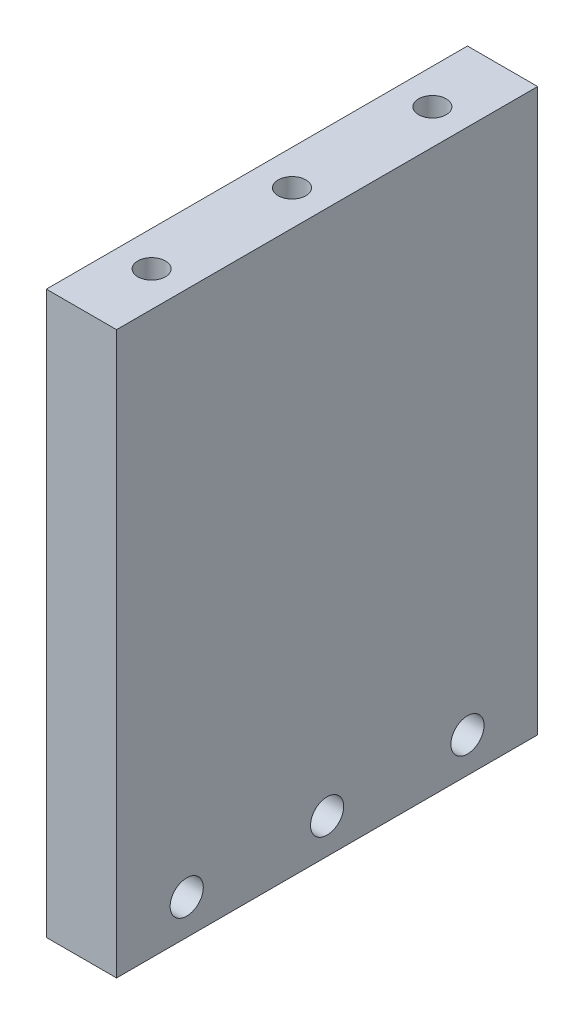
ISO-10303-21;
HEADER;
FILE_DESCRIPTION(('STEP AP214'),'2;1');
FILE_NAME('part.step','',(''),(''),'','','');
FILE_SCHEMA(('AUTOMOTIVE_DESIGN { 1 0 10303 214 1 1 1 1 }'));
ENDSEC;
DATA;
#1=APPLICATION_CONTEXT('core data for automotive mechanical design processes');
#2=APPLICATION_PROTOCOL_DEFINITION('international standard','automotive_design',2000,#1);
#3=PRODUCT_CONTEXT('',#1,'mechanical');
#4=PRODUCT('Part','Part','',(#3));
#5=PRODUCT_RELATED_PRODUCT_CATEGORY('part','',(#4));
#6=PRODUCT_DEFINITION_FORMATION('','',#4);
#7=PRODUCT_DEFINITION_CONTEXT('part definition',#1,'design');
#8=PRODUCT_DEFINITION('design','',#6,#7);
#9=PRODUCT_DEFINITION_SHAPE('','',#8);
#10=(LENGTH_UNIT() NAMED_UNIT(*) SI_UNIT(.MILLI.,.METRE.));
#11=(NAMED_UNIT(*) PLANE_ANGLE_UNIT() SI_UNIT($,.RADIAN.));
#12=(NAMED_UNIT(*) SI_UNIT($,.STERADIAN.) SOLID_ANGLE_UNIT());
#13=UNCERTAINTY_MEASURE_WITH_UNIT(LENGTH_MEASURE(1.E-05),#10,'distance_accuracy_value','');
#14=(GEOMETRIC_REPRESENTATION_CONTEXT(3) GLOBAL_UNCERTAINTY_ASSIGNED_CONTEXT((#13)) GLOBAL_UNIT_ASSIGNED_CONTEXT((#10,
#11,#12)) REPRESENTATION_CONTEXT('',''));
#15=CARTESIAN_POINT('',(0.,0.,0.));
#16=DIRECTION('',(0.,0.,1.));
#17=DIRECTION('',(1.,0.,0.));
#18=AXIS2_PLACEMENT_3D('',#15,#16,#17);
#19=CARTESIAN_POINT('',(0.,0.,38.1));
#20=DIRECTION('',(1.,0.,0.));
#21=DIRECTION('',(0.,0.,-1.));
#22=AXIS2_PLACEMENT_3D('',#19,#20,#21);
#23=PLANE('',#22);
#24=CARTESIAN_POINT('',(0.,3.175,6.35));
#25=DIRECTION('',(1.,0.,0.));
#26=DIRECTION('',(0.,0.,-1.));
#27=AXIS2_PLACEMENT_3D('',#24,#25,#26);
#28=CIRCLE('',#27,1.5);
#29=CARTESIAN_POINT('',(0.,3.175,4.85));
#30=VERTEX_POINT('',#29);
#31=EDGE_CURVE('E137',#30,#30,#28,.T.);
#32=ORIENTED_EDGE('',*,*,#31,.T.);
#33=EDGE_LOOP('',(#32));
#34=FACE_BOUND('',#33,.T.);
#35=CARTESIAN_POINT('',(0.,3.175,31.75));
#36=DIRECTION('',(1.,0.,0.));
#37=DIRECTION('',(0.,0.,-1.));
#38=AXIS2_PLACEMENT_3D('',#35,#36,#37);
#39=CIRCLE('',#38,1.5);
#40=CARTESIAN_POINT('',(0.,3.175,30.25));
#41=VERTEX_POINT('',#40);
#42=EDGE_CURVE('E163',#41,#41,#39,.T.);
#43=ORIENTED_EDGE('',*,*,#42,.T.);
#44=EDGE_LOOP('',(#43));
#45=FACE_BOUND('',#44,.T.);
#46=CARTESIAN_POINT('',(0.,3.175,19.05));
#47=DIRECTION('',(1.,0.,0.));
#48=DIRECTION('',(0.,0.,-1.));
#49=AXIS2_PLACEMENT_3D('',#46,#47,#48);
#50=CIRCLE('',#49,1.5);
#51=CARTESIAN_POINT('',(0.,3.175,17.55));
#52=VERTEX_POINT('',#51);
#53=EDGE_CURVE('E154',#52,#52,#50,.T.);
#54=ORIENTED_EDGE('',*,*,#53,.T.);
#55=EDGE_LOOP('',(#54));
#56=FACE_BOUND('',#55,.T.);
#57=DIRECTION('',(0.,-1.,0.));
#58=VECTOR('',#57,1.);
#59=CARTESIAN_POINT('',(0.,0.,0.));
#60=LINE('',#59,#58);
#61=CARTESIAN_POINT('',(0.,50.8,0.));
#62=VERTEX_POINT('',#61);
#63=CARTESIAN_POINT('',(0.,0.,0.));
#64=VERTEX_POINT('',#63);
#65=EDGE_CURVE('E133',#62,#64,#60,.T.);
#66=ORIENTED_EDGE('',*,*,#65,.T.);
#67=DIRECTION('',(0.,0.,-1.));
#68=VECTOR('',#67,1.);
#69=CARTESIAN_POINT('',(0.,0.,38.1));
#70=LINE('',#69,#68);
#71=CARTESIAN_POINT('',(0.,0.,38.1));
#72=VERTEX_POINT('',#71);
#73=EDGE_CURVE('E12',#72,#64,#70,.T.);
#74=ORIENTED_EDGE('',*,*,#73,.F.);
#75=DIRECTION('',(0.,-1.,0.));
#76=VECTOR('',#75,1.);
#77=CARTESIAN_POINT('',(0.,0.,38.1));
#78=LINE('',#77,#76);
#79=CARTESIAN_POINT('',(0.,50.8,38.1));
#80=VERTEX_POINT('',#79);
#81=EDGE_CURVE('E117',#80,#72,#78,.T.);
#82=ORIENTED_EDGE('',*,*,#81,.F.);
#83=DIRECTION('',(0.,0.,-1.));
#84=VECTOR('',#83,1.);
#85=CARTESIAN_POINT('',(0.,50.8,38.1));
#86=LINE('',#85,#84);
#87=EDGE_CURVE('E129',#80,#62,#86,.T.);
#88=ORIENTED_EDGE('',*,*,#87,.T.);
#89=EDGE_LOOP('',(#66,#74,#82,#88));
#90=FACE_BOUND('',#89,.T.);
#91=ADVANCED_FACE('F65',(#34,#45,#56,#90),#23,.F.);
#92=CARTESIAN_POINT('',(0.,0.,38.1));
#93=DIRECTION('',(0.,1.,0.));
#94=DIRECTION('',(0.,0.,1.));
#95=AXIS2_PLACEMENT_3D('',#92,#93,#94);
#96=PLANE('',#95);
#97=DIRECTION('',(1.,0.,0.));
#98=VECTOR('',#97,1.);
#99=CARTESIAN_POINT('',(0.,0.,0.));
#100=LINE('',#99,#98);
#101=CARTESIAN_POINT('',(6.35,0.,0.));
#102=VERTEX_POINT('',#101);
#103=EDGE_CURVE('E122',#64,#102,#100,.T.);
#104=ORIENTED_EDGE('',*,*,#103,.T.);
#105=DIRECTION('',(0.,0.,-1.));
#106=VECTOR('',#105,1.);
#107=CARTESIAN_POINT('',(6.35,0.,38.1));
#108=LINE('',#107,#106);
#109=CARTESIAN_POINT('',(6.35,0.,38.1));
#110=VERTEX_POINT('',#109);
#111=EDGE_CURVE('E74',#110,#102,#108,.T.);
#112=ORIENTED_EDGE('',*,*,#111,.F.);
#113=DIRECTION('',(1.,0.,0.));
#114=VECTOR('',#113,1.);
#115=CARTESIAN_POINT('',(0.,0.,38.1));
#116=LINE('',#115,#114);
#117=EDGE_CURVE('E112',#72,#110,#116,.T.);
#118=ORIENTED_EDGE('',*,*,#117,.F.);
#119=ORIENTED_EDGE('',*,*,#73,.T.);
#120=EDGE_LOOP('',(#104,#112,#118,#119));
#121=FACE_BOUND('',#120,.T.);
#122=ADVANCED_FACE('F121',(#121),#96,.F.);
#123=CARTESIAN_POINT('',(6.35,0.,38.1));
#124=DIRECTION('',(-1.,0.,0.));
#125=DIRECTION('',(0.,0.,1.));
#126=AXIS2_PLACEMENT_3D('',#123,#124,#125);
#127=PLANE('',#126);
#128=CARTESIAN_POINT('',(6.35,3.175,6.35));
#129=DIRECTION('',(1.,0.,0.));
#130=DIRECTION('',(0.,0.,-1.));
#131=AXIS2_PLACEMENT_3D('',#128,#129,#130);
#132=CIRCLE('',#131,1.5);
#133=CARTESIAN_POINT('',(6.35,3.175,4.85));
#134=VERTEX_POINT('',#133);
#135=EDGE_CURVE('E171',#134,#134,#132,.T.);
#136=ORIENTED_EDGE('',*,*,#135,.F.);
#137=EDGE_LOOP('',(#136));
#138=FACE_BOUND('',#137,.T.);
#139=CARTESIAN_POINT('',(6.35,3.175,31.75));
#140=DIRECTION('',(1.,0.,0.));
#141=DIRECTION('',(0.,0.,-1.));
#142=AXIS2_PLACEMENT_3D('',#139,#140,#141);
#143=CIRCLE('',#142,1.5);
#144=CARTESIAN_POINT('',(6.35,3.175,30.25));
#145=VERTEX_POINT('',#144);
#146=EDGE_CURVE('E167',#145,#145,#143,.T.);
#147=ORIENTED_EDGE('',*,*,#146,.F.);
#148=EDGE_LOOP('',(#147));
#149=FACE_BOUND('',#148,.T.);
#150=CARTESIAN_POINT('',(6.35,3.175,19.05));
#151=DIRECTION('',(1.,0.,0.));
#152=DIRECTION('',(0.,0.,-1.));
#153=AXIS2_PLACEMENT_3D('',#150,#151,#152);
#154=CIRCLE('',#153,1.5);
#155=CARTESIAN_POINT('',(6.35,3.175,17.55));
#156=VERTEX_POINT('',#155);
#157=EDGE_CURVE('E158',#156,#156,#154,.T.);
#158=ORIENTED_EDGE('',*,*,#157,.F.);
#159=EDGE_LOOP('',(#158));
#160=FACE_BOUND('',#159,.T.);
#161=DIRECTION('',(0.,1.,0.));
#162=VECTOR('',#161,1.);
#163=CARTESIAN_POINT('',(6.35,0.,0.));
#164=LINE('',#163,#162);
#165=CARTESIAN_POINT('',(6.35,50.8,0.));
#166=VERTEX_POINT('',#165);
#167=EDGE_CURVE('E99',#102,#166,#164,.T.);
#168=ORIENTED_EDGE('',*,*,#167,.T.);
#169=DIRECTION('',(0.,0.,-1.));
#170=VECTOR('',#169,1.);
#171=CARTESIAN_POINT('',(6.35,50.8,38.1));
#172=LINE('',#171,#170);
#173=CARTESIAN_POINT('',(6.35,50.8,38.1));
#174=VERTEX_POINT('',#173);
#175=EDGE_CURVE('E124',#174,#166,#172,.T.);
#176=ORIENTED_EDGE('',*,*,#175,.F.);
#177=DIRECTION('',(0.,1.,0.));
#178=VECTOR('',#177,1.);
#179=CARTESIAN_POINT('',(6.35,0.,38.1));
#180=LINE('',#179,#178);
#181=EDGE_CURVE('E115',#110,#174,#180,.T.);
#182=ORIENTED_EDGE('',*,*,#181,.F.);
#183=ORIENTED_EDGE('',*,*,#111,.T.);
#184=EDGE_LOOP('',(#168,#176,#182,#183));
#185=FACE_BOUND('',#184,.T.);
#186=ADVANCED_FACE('F125',(#138,#149,#160,#185),#127,.F.);
#187=CARTESIAN_POINT('',(0.,50.8,38.1));
#188=DIRECTION('',(0.,-1.,0.));
#189=DIRECTION('',(0.,0.,-1.));
#190=AXIS2_PLACEMENT_3D('',#187,#188,#189);
#191=PLANE('',#190);
#192=CARTESIAN_POINT('',(3.175,50.8,6.35));
#193=DIRECTION('',(0.,1.,0.));
#194=DIRECTION('',(0.,0.,1.));
#195=AXIS2_PLACEMENT_3D('',#192,#193,#194);
#196=CIRCLE('',#195,1.25);
#197=CARTESIAN_POINT('',(3.175,50.8,7.6));
#198=VERTEX_POINT('',#197);
#199=EDGE_CURVE('E194',#198,#198,#196,.T.);
#200=ORIENTED_EDGE('',*,*,#199,.F.);
#201=EDGE_LOOP('',(#200));
#202=FACE_BOUND('',#201,.T.);
#203=CARTESIAN_POINT('',(3.175,50.8,31.75));
#204=DIRECTION('',(0.,1.,0.));
#205=DIRECTION('',(0.,0.,1.));
#206=AXIS2_PLACEMENT_3D('',#203,#204,#205);
#207=CIRCLE('',#206,1.25);
#208=CARTESIAN_POINT('',(3.175,50.8,33.));
#209=VERTEX_POINT('',#208);
#210=EDGE_CURVE('E190',#209,#209,#207,.T.);
#211=ORIENTED_EDGE('',*,*,#210,.F.);
#212=EDGE_LOOP('',(#211));
#213=FACE_BOUND('',#212,.T.);
#214=CARTESIAN_POINT('',(3.175,50.8,19.05));
#215=DIRECTION('',(0.,1.,0.));
#216=DIRECTION('',(0.,0.,1.));
#217=AXIS2_PLACEMENT_3D('',#214,#215,#216);
#218=CIRCLE('',#217,1.25);
#219=CARTESIAN_POINT('',(3.175,50.8,20.3));
#220=VERTEX_POINT('',#219);
#221=EDGE_CURVE('E182',#220,#220,#218,.T.);
#222=ORIENTED_EDGE('',*,*,#221,.F.);
#223=EDGE_LOOP('',(#222));
#224=FACE_BOUND('',#223,.T.);
#225=DIRECTION('',(-1.,0.,0.));
#226=VECTOR('',#225,1.);
#227=CARTESIAN_POINT('',(0.,50.8,0.));
#228=LINE('',#227,#226);
#229=EDGE_CURVE('E105',#166,#62,#228,.T.);
#230=ORIENTED_EDGE('',*,*,#229,.T.);
#231=ORIENTED_EDGE('',*,*,#87,.F.);
#232=DIRECTION('',(-1.,0.,0.));
#233=VECTOR('',#232,1.);
#234=CARTESIAN_POINT('',(0.,50.8,38.1));
#235=LINE('',#234,#233);
#236=EDGE_CURVE('E82',#174,#80,#235,.T.);
#237=ORIENTED_EDGE('',*,*,#236,.F.);
#238=ORIENTED_EDGE('',*,*,#175,.T.);
#239=EDGE_LOOP('',(#230,#231,#237,#238));
#240=FACE_BOUND('',#239,.T.);
#241=ADVANCED_FACE('F147',(#202,#213,#224,#240),#191,.F.);
#242=CARTESIAN_POINT('',(0.,0.,38.1));
#243=DIRECTION('',(0.,0.,-1.));
#244=DIRECTION('',(-1.,0.,0.));
#245=AXIS2_PLACEMENT_3D('',#242,#243,#244);
#246=PLANE('',#245);
#247=ORIENTED_EDGE('',*,*,#81,.T.);
#248=ORIENTED_EDGE('',*,*,#117,.T.);
#249=ORIENTED_EDGE('',*,*,#181,.T.);
#250=ORIENTED_EDGE('',*,*,#236,.T.);
#251=EDGE_LOOP('',(#247,#248,#249,#250));
#252=FACE_BOUND('',#251,.T.);
#253=ADVANCED_FACE('F113',(#252),#246,.F.);
#254=CARTESIAN_POINT('',(0.,0.,0.));
#255=DIRECTION('',(0.,0.,-1.));
#256=DIRECTION('',(-1.,0.,0.));
#257=AXIS2_PLACEMENT_3D('',#254,#255,#256);
#258=PLANE('',#257);
#259=ORIENTED_EDGE('',*,*,#65,.F.);
#260=ORIENTED_EDGE('',*,*,#229,.F.);
#261=ORIENTED_EDGE('',*,*,#167,.F.);
#262=ORIENTED_EDGE('',*,*,#103,.F.);
#263=EDGE_LOOP('',(#259,#260,#261,#262));
#264=FACE_BOUND('',#263,.T.);
#265=ADVANCED_FACE('F150',(#264),#258,.T.);
#266=CARTESIAN_POINT('',(0.,3.175,19.05));
#267=DIRECTION('',(1.,0.,0.));
#268=DIRECTION('',(0.,0.,-1.));
#269=AXIS2_PLACEMENT_3D('',#266,#267,#268);
#270=CYLINDRICAL_SURFACE('',#269,1.5);
#271=ORIENTED_EDGE('',*,*,#157,.T.);
#272=EDGE_LOOP('',(#271));
#273=FACE_BOUND('',#272,.T.);
#274=ORIENTED_EDGE('',*,*,#53,.F.);
#275=EDGE_LOOP('',(#274));
#276=FACE_BOUND('',#275,.T.);
#277=ADVANCED_FACE('F248',(#273,#276),#270,.F.);
#278=CARTESIAN_POINT('',(0.,3.175,31.75));
#279=DIRECTION('',(1.,0.,0.));
#280=DIRECTION('',(0.,0.,-1.));
#281=AXIS2_PLACEMENT_3D('',#278,#279,#280);
#282=CYLINDRICAL_SURFACE('',#281,1.5);
#283=ORIENTED_EDGE('',*,*,#146,.T.);
#284=EDGE_LOOP('',(#283));
#285=FACE_BOUND('',#284,.T.);
#286=ORIENTED_EDGE('',*,*,#42,.F.);
#287=EDGE_LOOP('',(#286));
#288=FACE_BOUND('',#287,.T.);
#289=ADVANCED_FACE('F250',(#285,#288),#282,.F.);
#290=CARTESIAN_POINT('',(0.,3.175,6.35));
#291=DIRECTION('',(1.,0.,0.));
#292=DIRECTION('',(0.,0.,-1.));
#293=AXIS2_PLACEMENT_3D('',#290,#291,#292);
#294=CYLINDRICAL_SURFACE('',#293,1.5);
#295=ORIENTED_EDGE('',*,*,#31,.F.);
#296=EDGE_LOOP('',(#295));
#297=FACE_BOUND('',#296,.T.);
#298=ORIENTED_EDGE('',*,*,#135,.T.);
#299=EDGE_LOOP('',(#298));
#300=FACE_BOUND('',#299,.T.);
#301=ADVANCED_FACE('F222',(#297,#300),#294,.F.);
#302=CARTESIAN_POINT('',(3.175,44.45,19.05));
#303=DIRECTION('',(0.,1.,0.));
#304=DIRECTION('',(0.,0.,1.));
#305=AXIS2_PLACEMENT_3D('',#302,#303,#304);
#306=CYLINDRICAL_SURFACE('',#305,1.25);
#307=ORIENTED_EDGE('',*,*,#221,.T.);
#308=EDGE_LOOP('',(#307));
#309=FACE_BOUND('',#308,.T.);
#310=CARTESIAN_POINT('',(3.175,44.45,19.05));
#311=DIRECTION('',(0.,1.,0.));
#312=DIRECTION('',(0.,0.,1.));
#313=AXIS2_PLACEMENT_3D('',#310,#311,#312);
#314=CIRCLE('',#313,1.25);
#315=CARTESIAN_POINT('',(3.175,44.45,20.3));
#316=VERTEX_POINT('',#315);
#317=EDGE_CURVE('E178',#316,#316,#314,.T.);
#318=ORIENTED_EDGE('',*,*,#317,.F.);
#319=EDGE_LOOP('',(#318));
#320=FACE_BOUND('',#319,.T.);
#321=ADVANCED_FACE('F218',(#309,#320),#306,.F.);
#322=CARTESIAN_POINT('',(0.,44.45,0.));
#323=DIRECTION('',(0.,1.,0.));
#324=DIRECTION('',(0.,0.,1.));
#325=AXIS2_PLACEMENT_3D('',#322,#323,#324);
#326=PLANE('',#325);
#327=ORIENTED_EDGE('',*,*,#317,.T.);
#328=EDGE_LOOP('',(#327));
#329=FACE_BOUND('',#328,.T.);
#330=ADVANCED_FACE('F221',(#329),#326,.T.);
#331=CARTESIAN_POINT('',(3.175,44.45,31.75));
#332=DIRECTION('',(0.,1.,0.));
#333=DIRECTION('',(0.,0.,1.));
#334=AXIS2_PLACEMENT_3D('',#331,#332,#333);
#335=CYLINDRICAL_SURFACE('',#334,1.25);
#336=CARTESIAN_POINT('',(3.175,44.45,31.75));
#337=DIRECTION('',(0.,1.,0.));
#338=DIRECTION('',(0.,0.,1.));
#339=AXIS2_PLACEMENT_3D('',#336,#337,#338);
#340=CIRCLE('',#339,1.25);
#341=CARTESIAN_POINT('',(3.175,44.45,33.));
#342=VERTEX_POINT('',#341);
#343=EDGE_CURVE('E186',#342,#342,#340,.T.);
#344=ORIENTED_EDGE('',*,*,#343,.F.);
#345=EDGE_LOOP('',(#344));
#346=FACE_BOUND('',#345,.T.);
#347=ORIENTED_EDGE('',*,*,#210,.T.);
#348=EDGE_LOOP('',(#347));
#349=FACE_BOUND('',#348,.T.);
#350=ADVANCED_FACE('F227',(#346,#349),#335,.F.);
#351=CARTESIAN_POINT('',(0.,44.45,0.));
#352=DIRECTION('',(0.,1.,0.));
#353=DIRECTION('',(0.,0.,1.));
#354=AXIS2_PLACEMENT_3D('',#351,#352,#353);
#355=PLANE('',#354);
#356=ORIENTED_EDGE('',*,*,#343,.T.);
#357=EDGE_LOOP('',(#356));
#358=FACE_BOUND('',#357,.T.);
#359=ADVANCED_FACE('F207',(#358),#355,.T.);
#360=CARTESIAN_POINT('',(3.175,44.45,6.35));
#361=DIRECTION('',(0.,1.,0.));
#362=DIRECTION('',(0.,0.,1.));
#363=AXIS2_PLACEMENT_3D('',#360,#361,#362);
#364=CYLINDRICAL_SURFACE('',#363,1.25);
#365=CARTESIAN_POINT('',(3.175,44.45,6.35));
#366=DIRECTION('',(0.,1.,0.));
#367=DIRECTION('',(0.,0.,1.));
#368=AXIS2_PLACEMENT_3D('',#365,#366,#367);
#369=CIRCLE('',#368,1.25);
#370=CARTESIAN_POINT('',(3.175,44.45,7.6));
#371=VERTEX_POINT('',#370);
#372=EDGE_CURVE('E159',#371,#371,#369,.T.);
#373=ORIENTED_EDGE('',*,*,#372,.F.);
#374=EDGE_LOOP('',(#373));
#375=FACE_BOUND('',#374,.T.);
#376=ORIENTED_EDGE('',*,*,#199,.T.);
#377=EDGE_LOOP('',(#376));
#378=FACE_BOUND('',#377,.T.);
#379=ADVANCED_FACE('F204',(#375,#378),#364,.F.);
#380=CARTESIAN_POINT('',(0.,44.45,0.));
#381=DIRECTION('',(0.,1.,0.));
#382=DIRECTION('',(0.,0.,1.));
#383=AXIS2_PLACEMENT_3D('',#380,#381,#382);
#384=PLANE('',#383);
#385=ORIENTED_EDGE('',*,*,#372,.T.);
#386=EDGE_LOOP('',(#385));
#387=FACE_BOUND('',#386,.T.);
#388=ADVANCED_FACE('F202',(#387),#384,.T.);
#389=CLOSED_SHELL('',(#91,#122,#186,#241,#253,#265,#277,#289,#301,#321,#330,#350,#359,#379,#388));
#390=MANIFOLD_SOLID_BREP('B2',#389);
#391=ADVANCED_BREP_SHAPE_REPRESENTATION('',(#18,#390),#14);
#392=SHAPE_DEFINITION_REPRESENTATION(#9,#391);
ENDSEC;
END-ISO-10303-21;
